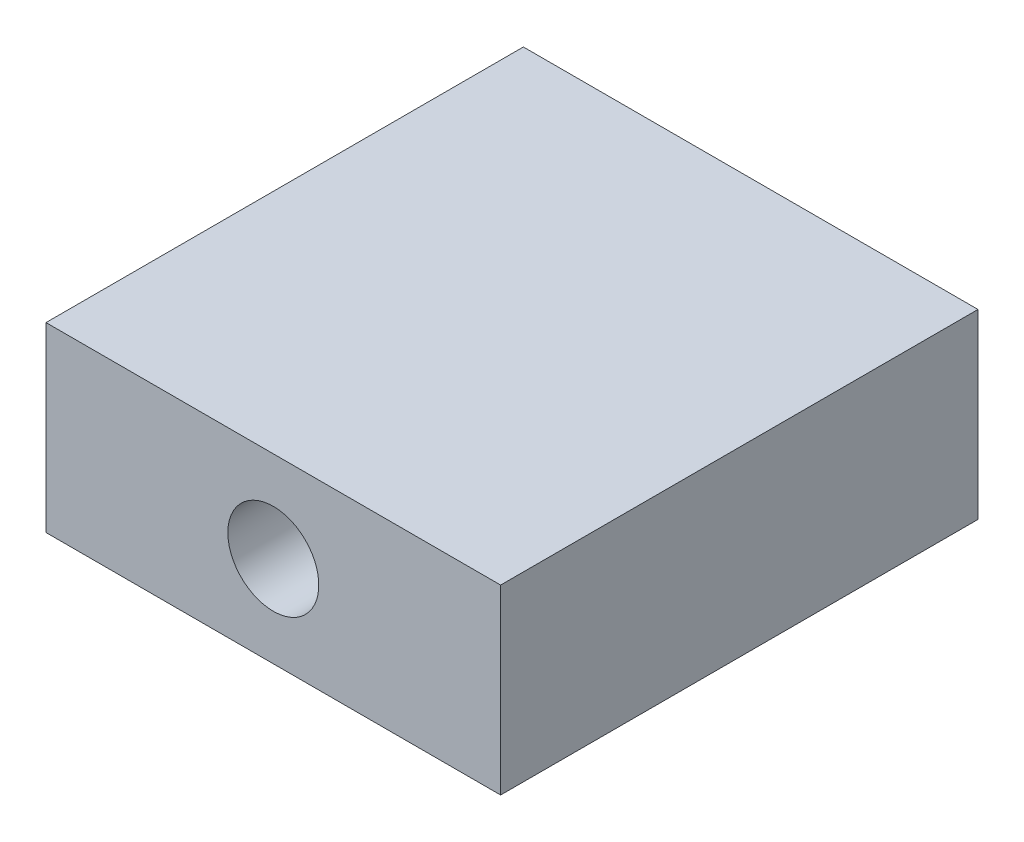
ISO-10303-21;
HEADER;
FILE_DESCRIPTION(('STEP AP214'),'2;1');
FILE_NAME('part.step','',(''),(''),'','','');
FILE_SCHEMA(('AUTOMOTIVE_DESIGN { 1 0 10303 214 1 1 1 1 }'));
ENDSEC;
DATA;
#1=APPLICATION_CONTEXT('core data for automotive mechanical design processes');
#2=APPLICATION_PROTOCOL_DEFINITION('international standard','automotive_design',2000,#1);
#3=PRODUCT_CONTEXT('',#1,'mechanical');
#4=PRODUCT('Part','Part','',(#3));
#5=PRODUCT_RELATED_PRODUCT_CATEGORY('part','',(#4));
#6=PRODUCT_DEFINITION_FORMATION('','',#4);
#7=PRODUCT_DEFINITION_CONTEXT('part definition',#1,'design');
#8=PRODUCT_DEFINITION('design','',#6,#7);
#9=PRODUCT_DEFINITION_SHAPE('','',#8);
#10=(LENGTH_UNIT() NAMED_UNIT(*) SI_UNIT(.MILLI.,.METRE.));
#11=(NAMED_UNIT(*) PLANE_ANGLE_UNIT() SI_UNIT($,.RADIAN.));
#12=(NAMED_UNIT(*) SI_UNIT($,.STERADIAN.) SOLID_ANGLE_UNIT());
#13=UNCERTAINTY_MEASURE_WITH_UNIT(LENGTH_MEASURE(1.E-05),#10,'distance_accuracy_value','');
#14=(GEOMETRIC_REPRESENTATION_CONTEXT(3) GLOBAL_UNCERTAINTY_ASSIGNED_CONTEXT((#13)) GLOBAL_UNIT_ASSIGNED_CONTEXT((#10,
#11,#12)) REPRESENTATION_CONTEXT('',''));
#15=CARTESIAN_POINT('',(0.,0.,0.));
#16=DIRECTION('',(0.,0.,1.));
#17=DIRECTION('',(1.,0.,0.));
#18=AXIS2_PLACEMENT_3D('',#15,#16,#17);
#19=CARTESIAN_POINT('',(0.,0.,21.));
#20=DIRECTION('',(0.,0.,1.));
#21=DIRECTION('',(1.,0.,0.));
#22=AXIS2_PLACEMENT_3D('',#19,#20,#21);
#23=PLANE('',#22);
#24=DIRECTION('',(0.,-1.,0.));
#25=VECTOR('',#24,1.);
#26=CARTESIAN_POINT('',(0.,0.,21.));
#27=LINE('',#26,#25);
#28=CARTESIAN_POINT('',(0.,0.,21.));
#29=VERTEX_POINT('',#28);
#30=CARTESIAN_POINT('',(0.,-8.,21.));
#31=VERTEX_POINT('',#30);
#32=EDGE_CURVE('E84',#29,#31,#27,.T.);
#33=ORIENTED_EDGE('',*,*,#32,.T.);
#34=DIRECTION('',(1.,0.,0.));
#35=VECTOR('',#34,1.);
#36=CARTESIAN_POINT('',(0.,-8.,21.));
#37=LINE('',#36,#35);
#38=CARTESIAN_POINT('',(20.,-8.,21.));
#39=VERTEX_POINT('',#38);
#40=EDGE_CURVE('E79',#31,#39,#37,.T.);
#41=ORIENTED_EDGE('',*,*,#40,.T.);
#42=DIRECTION('',(0.,1.,0.));
#43=VECTOR('',#42,1.);
#44=CARTESIAN_POINT('',(20.,0.,21.));
#45=LINE('',#44,#43);
#46=CARTESIAN_POINT('',(20.,0.,21.));
#47=VERTEX_POINT('',#46);
#48=EDGE_CURVE('E82',#39,#47,#45,.T.);
#49=ORIENTED_EDGE('',*,*,#48,.T.);
#50=DIRECTION('',(-1.,0.,0.));
#51=VECTOR('',#50,1.);
#52=CARTESIAN_POINT('',(0.,0.,21.));
#53=LINE('',#52,#51);
#54=EDGE_CURVE('E49',#47,#29,#53,.T.);
#55=ORIENTED_EDGE('',*,*,#54,.T.);
#56=EDGE_LOOP('',(#33,#41,#49,#55));
#57=FACE_BOUND('',#56,.T.);
#58=CARTESIAN_POINT('',(10.,-4.,21.));
#59=DIRECTION('',(0.,0.,1.));
#60=DIRECTION('',(1.,0.,0.));
#61=AXIS2_PLACEMENT_3D('',#58,#59,#60);
#62=CIRCLE('',#61,2.);
#63=CARTESIAN_POINT('',(8.,-4.,21.));
#64=VERTEX_POINT('',#63);
#65=EDGE_CURVE('E99',#64,#64,#62,.T.);
#66=ORIENTED_EDGE('',*,*,#65,.F.);
#67=EDGE_LOOP('',(#66));
#68=FACE_BOUND('',#67,.T.);
#69=ADVANCED_FACE('F32',(#57,#68),#23,.T.);
#70=CARTESIAN_POINT('',(0.,0.,0.));
#71=DIRECTION('',(0.,0.,1.));
#72=DIRECTION('',(1.,0.,0.));
#73=AXIS2_PLACEMENT_3D('',#70,#71,#72);
#74=PLANE('',#73);
#75=DIRECTION('',(0.,-1.,0.));
#76=VECTOR('',#75,1.);
#77=CARTESIAN_POINT('',(0.,0.,0.));
#78=LINE('',#77,#76);
#79=CARTESIAN_POINT('',(0.,0.,0.));
#80=VERTEX_POINT('',#79);
#81=CARTESIAN_POINT('',(0.,-8.,0.));
#82=VERTEX_POINT('',#81);
#83=EDGE_CURVE('E96',#80,#82,#78,.T.);
#84=ORIENTED_EDGE('',*,*,#83,.F.);
#85=DIRECTION('',(-1.,0.,0.));
#86=VECTOR('',#85,1.);
#87=CARTESIAN_POINT('',(0.,0.,0.));
#88=LINE('',#87,#86);
#89=CARTESIAN_POINT('',(20.,0.,0.));
#90=VERTEX_POINT('',#89);
#91=EDGE_CURVE('E72',#90,#80,#88,.T.);
#92=ORIENTED_EDGE('',*,*,#91,.F.);
#93=DIRECTION('',(0.,1.,0.));
#94=VECTOR('',#93,1.);
#95=CARTESIAN_POINT('',(20.,0.,0.));
#96=LINE('',#95,#94);
#97=CARTESIAN_POINT('',(20.,-8.,0.));
#98=VERTEX_POINT('',#97);
#99=EDGE_CURVE('E66',#98,#90,#96,.T.);
#100=ORIENTED_EDGE('',*,*,#99,.F.);
#101=DIRECTION('',(1.,0.,0.));
#102=VECTOR('',#101,1.);
#103=CARTESIAN_POINT('',(0.,-8.,0.));
#104=LINE('',#103,#102);
#105=EDGE_CURVE('E88',#82,#98,#104,.T.);
#106=ORIENTED_EDGE('',*,*,#105,.F.);
#107=EDGE_LOOP('',(#84,#92,#100,#106));
#108=FACE_BOUND('',#107,.T.);
#109=CARTESIAN_POINT('',(10.,-4.,0.));
#110=DIRECTION('',(0.,0.,1.));
#111=DIRECTION('',(1.,0.,0.));
#112=AXIS2_PLACEMENT_3D('',#109,#110,#111);
#113=CIRCLE('',#112,2.);
#114=CARTESIAN_POINT('',(8.,-4.,0.));
#115=VERTEX_POINT('',#114);
#116=EDGE_CURVE('E111',#115,#115,#113,.T.);
#117=ORIENTED_EDGE('',*,*,#116,.T.);
#118=EDGE_LOOP('',(#117));
#119=FACE_BOUND('',#118,.T.);
#120=ADVANCED_FACE('F107',(#108,#119),#74,.F.);
#121=CARTESIAN_POINT('',(0.,0.,21.));
#122=DIRECTION('',(1.,0.,0.));
#123=DIRECTION('',(0.,0.,-1.));
#124=AXIS2_PLACEMENT_3D('',#121,#122,#123);
#125=PLANE('',#124);
#126=ORIENTED_EDGE('',*,*,#83,.T.);
#127=DIRECTION('',(0.,0.,-1.));
#128=VECTOR('',#127,1.);
#129=CARTESIAN_POINT('',(0.,-8.,21.));
#130=LINE('',#129,#128);
#131=EDGE_CURVE('E11',#31,#82,#130,.T.);
#132=ORIENTED_EDGE('',*,*,#131,.F.);
#133=ORIENTED_EDGE('',*,*,#32,.F.);
#134=DIRECTION('',(0.,0.,-1.));
#135=VECTOR('',#134,1.);
#136=CARTESIAN_POINT('',(0.,0.,21.));
#137=LINE('',#136,#135);
#138=EDGE_CURVE('E92',#29,#80,#137,.T.);
#139=ORIENTED_EDGE('',*,*,#138,.T.);
#140=EDGE_LOOP('',(#126,#132,#133,#139));
#141=FACE_BOUND('',#140,.T.);
#142=ADVANCED_FACE('F34',(#141),#125,.F.);
#143=CARTESIAN_POINT('',(0.,-8.,21.));
#144=DIRECTION('',(0.,1.,0.));
#145=DIRECTION('',(0.,0.,1.));
#146=AXIS2_PLACEMENT_3D('',#143,#144,#145);
#147=PLANE('',#146);
#148=ORIENTED_EDGE('',*,*,#105,.T.);
#149=DIRECTION('',(0.,0.,-1.));
#150=VECTOR('',#149,1.);
#151=CARTESIAN_POINT('',(20.,-8.,21.));
#152=LINE('',#151,#150);
#153=EDGE_CURVE('E41',#39,#98,#152,.T.);
#154=ORIENTED_EDGE('',*,*,#153,.F.);
#155=ORIENTED_EDGE('',*,*,#40,.F.);
#156=ORIENTED_EDGE('',*,*,#131,.T.);
#157=EDGE_LOOP('',(#148,#154,#155,#156));
#158=FACE_BOUND('',#157,.T.);
#159=ADVANCED_FACE('F87',(#158),#147,.F.);
#160=CARTESIAN_POINT('',(20.,0.,21.));
#161=DIRECTION('',(-1.,0.,0.));
#162=DIRECTION('',(0.,0.,1.));
#163=AXIS2_PLACEMENT_3D('',#160,#161,#162);
#164=PLANE('',#163);
#165=ORIENTED_EDGE('',*,*,#99,.T.);
#166=DIRECTION('',(0.,0.,-1.));
#167=VECTOR('',#166,1.);
#168=CARTESIAN_POINT('',(20.,0.,21.));
#169=LINE('',#168,#167);
#170=EDGE_CURVE('E89',#47,#90,#169,.T.);
#171=ORIENTED_EDGE('',*,*,#170,.F.);
#172=ORIENTED_EDGE('',*,*,#48,.F.);
#173=ORIENTED_EDGE('',*,*,#153,.T.);
#174=EDGE_LOOP('',(#165,#171,#172,#173));
#175=FACE_BOUND('',#174,.T.);
#176=ADVANCED_FACE('F90',(#175),#164,.F.);
#177=CARTESIAN_POINT('',(0.,0.,21.));
#178=DIRECTION('',(0.,-1.,0.));
#179=DIRECTION('',(0.,0.,-1.));
#180=AXIS2_PLACEMENT_3D('',#177,#178,#179);
#181=PLANE('',#180);
#182=ORIENTED_EDGE('',*,*,#91,.T.);
#183=ORIENTED_EDGE('',*,*,#138,.F.);
#184=ORIENTED_EDGE('',*,*,#54,.F.);
#185=ORIENTED_EDGE('',*,*,#170,.T.);
#186=EDGE_LOOP('',(#182,#183,#184,#185));
#187=FACE_BOUND('',#186,.T.);
#188=ADVANCED_FACE('F104',(#187),#181,.F.);
#189=CARTESIAN_POINT('',(10.,-4.,21.));
#190=DIRECTION('',(0.,0.,-1.));
#191=DIRECTION('',(-1.,0.,0.));
#192=AXIS2_PLACEMENT_3D('',#189,#190,#191);
#193=CYLINDRICAL_SURFACE('',#192,2.);
#194=CARTESIAN_POINT('',(8.,-4.,21.));
#195=CARTESIAN_POINT('',(8.,-4.,20.78125));
#196=CARTESIAN_POINT('',(8.,-4.,20.5625));
#197=CARTESIAN_POINT('',(8.,-4.,20.125));
#198=CARTESIAN_POINT('',(8.,-4.,19.90625));
#199=CARTESIAN_POINT('',(8.,-4.,19.46875));
#200=CARTESIAN_POINT('',(8.,-4.,19.25));
#201=CARTESIAN_POINT('',(8.,-4.,18.8125));
#202=CARTESIAN_POINT('',(8.,-4.,18.59375));
#203=CARTESIAN_POINT('',(8.,-4.,18.15625));
#204=CARTESIAN_POINT('',(8.,-4.,17.9375));
#205=CARTESIAN_POINT('',(8.,-4.,17.5));
#206=CARTESIAN_POINT('',(8.,-4.,17.28125));
#207=CARTESIAN_POINT('',(8.,-4.,16.84375));
#208=CARTESIAN_POINT('',(8.,-4.,16.625));
#209=CARTESIAN_POINT('',(8.,-4.,16.1875));
#210=CARTESIAN_POINT('',(8.,-4.,15.96875));
#211=CARTESIAN_POINT('',(8.,-4.,15.53125));
#212=CARTESIAN_POINT('',(8.,-4.,15.3125));
#213=CARTESIAN_POINT('',(8.,-4.,14.875));
#214=CARTESIAN_POINT('',(8.,-4.,14.65625));
#215=CARTESIAN_POINT('',(8.,-4.,14.21875));
#216=CARTESIAN_POINT('',(8.,-4.,14.));
#217=CARTESIAN_POINT('',(8.,-4.,13.5625));
#218=CARTESIAN_POINT('',(8.,-4.,13.34375));
#219=CARTESIAN_POINT('',(8.,-4.,12.90625));
#220=CARTESIAN_POINT('',(8.,-4.,12.6875));
#221=CARTESIAN_POINT('',(8.,-4.,12.25));
#222=CARTESIAN_POINT('',(8.,-4.,12.03125));
#223=CARTESIAN_POINT('',(8.,-4.,11.59375));
#224=CARTESIAN_POINT('',(8.,-4.,11.375));
#225=CARTESIAN_POINT('',(8.,-4.,10.9375));
#226=CARTESIAN_POINT('',(8.,-4.,10.71875));
#227=CARTESIAN_POINT('',(8.,-4.,10.28125));
#228=CARTESIAN_POINT('',(8.,-4.,10.0625));
#229=CARTESIAN_POINT('',(8.,-4.,9.625));
#230=CARTESIAN_POINT('',(8.,-4.,9.40625));
#231=CARTESIAN_POINT('',(8.,-4.,8.96875));
#232=CARTESIAN_POINT('',(8.,-4.,8.75));
#233=CARTESIAN_POINT('',(8.,-4.,8.3125));
#234=CARTESIAN_POINT('',(8.,-4.,8.09375));
#235=CARTESIAN_POINT('',(8.,-4.,7.65625));
#236=CARTESIAN_POINT('',(8.,-4.,7.4375));
#237=CARTESIAN_POINT('',(8.,-4.,7.));
#238=CARTESIAN_POINT('',(8.,-4.,6.78125));
#239=CARTESIAN_POINT('',(8.,-4.,6.34375));
#240=CARTESIAN_POINT('',(8.,-4.,6.125));
#241=CARTESIAN_POINT('',(8.,-4.,5.6875));
#242=CARTESIAN_POINT('',(8.,-4.,5.46875));
#243=CARTESIAN_POINT('',(8.,-4.,5.03125));
#244=CARTESIAN_POINT('',(8.,-4.,4.8125));
#245=CARTESIAN_POINT('',(8.,-4.,4.375));
#246=CARTESIAN_POINT('',(8.,-4.,4.15625));
#247=CARTESIAN_POINT('',(8.,-4.,3.71875));
#248=CARTESIAN_POINT('',(8.,-4.,3.5));
#249=CARTESIAN_POINT('',(8.,-4.,3.0625));
#250=CARTESIAN_POINT('',(8.,-4.,2.84375));
#251=CARTESIAN_POINT('',(8.,-4.,2.40625));
#252=CARTESIAN_POINT('',(8.,-4.,2.1875));
#253=CARTESIAN_POINT('',(8.,-4.,1.75));
#254=CARTESIAN_POINT('',(8.,-4.,1.53125));
#255=CARTESIAN_POINT('',(8.,-4.,1.09375));
#256=CARTESIAN_POINT('',(8.,-4.,0.875000000000001));
#257=CARTESIAN_POINT('',(8.,-4.,0.4375));
#258=CARTESIAN_POINT('',(8.,-4.,0.21875));
#259=CARTESIAN_POINT('',(8.,-4.,0.));
#260=B_SPLINE_CURVE_WITH_KNOTS('',3,(#194,#195,#196,#197,#198,#199,#200,#201,#202,#203,#204,
#205,#206,#207,#208,#209,#210,#211,#212,#213,#214,#215,#216,#217,#218,#219,#220,#221,#222,#223,
#224,#225,#226,#227,#228,#229,#230,#231,#232,#233,#234,#235,#236,#237,#238,#239,#240,#241,#242,
#243,#244,#245,#246,#247,#248,#249,#250,#251,#252,#253,#254,#255,#256,#257,#258,#259),
.UNSPECIFIED.,.F.,.F.,(4,2,2,2,2,2,2,2,2,2,2,2,2,2,2,2,2,2,2,2,2,2,2,2,2,2,2,2,2,2,2,2,4),(0.,
0.656250000000001,1.3125,1.96875,2.625,3.28125,3.9375,4.59375,5.25,5.90625,6.5625,7.21875,7.875,
8.53125,9.1875,9.84375,10.5,11.15625,11.8125,12.46875,13.125,13.78125,14.4375,15.09375,15.75,
16.40625,17.0625,17.71875,18.375,19.03125,19.6875,20.34375,21.),.UNSPECIFIED.);
#261=EDGE_CURVE('BSEAM117',#64,#115,#260,.T.);
#262=ORIENTED_EDGE('',*,*,#65,.T.);
#263=ORIENTED_EDGE('',*,*,#116,.F.);
#264=ORIENTED_EDGE('',*,*,#261,.T.);
#265=ORIENTED_EDGE('',*,*,#261,.F.);
#266=EDGE_LOOP('',(#262,#264,#263,#265));
#267=FACE_BOUND('',#266,.T.);
#268=ADVANCED_FACE('F117',(#267),#193,.F.);
#269=CLOSED_SHELL('',(#69,#120,#142,#159,#176,#188,#268));
#270=MANIFOLD_SOLID_BREP('B2',#269);
#271=ADVANCED_BREP_SHAPE_REPRESENTATION('',(#18,#270),#14);
#272=SHAPE_DEFINITION_REPRESENTATION(#9,#271);
ENDSEC;
END-ISO-10303-21;
